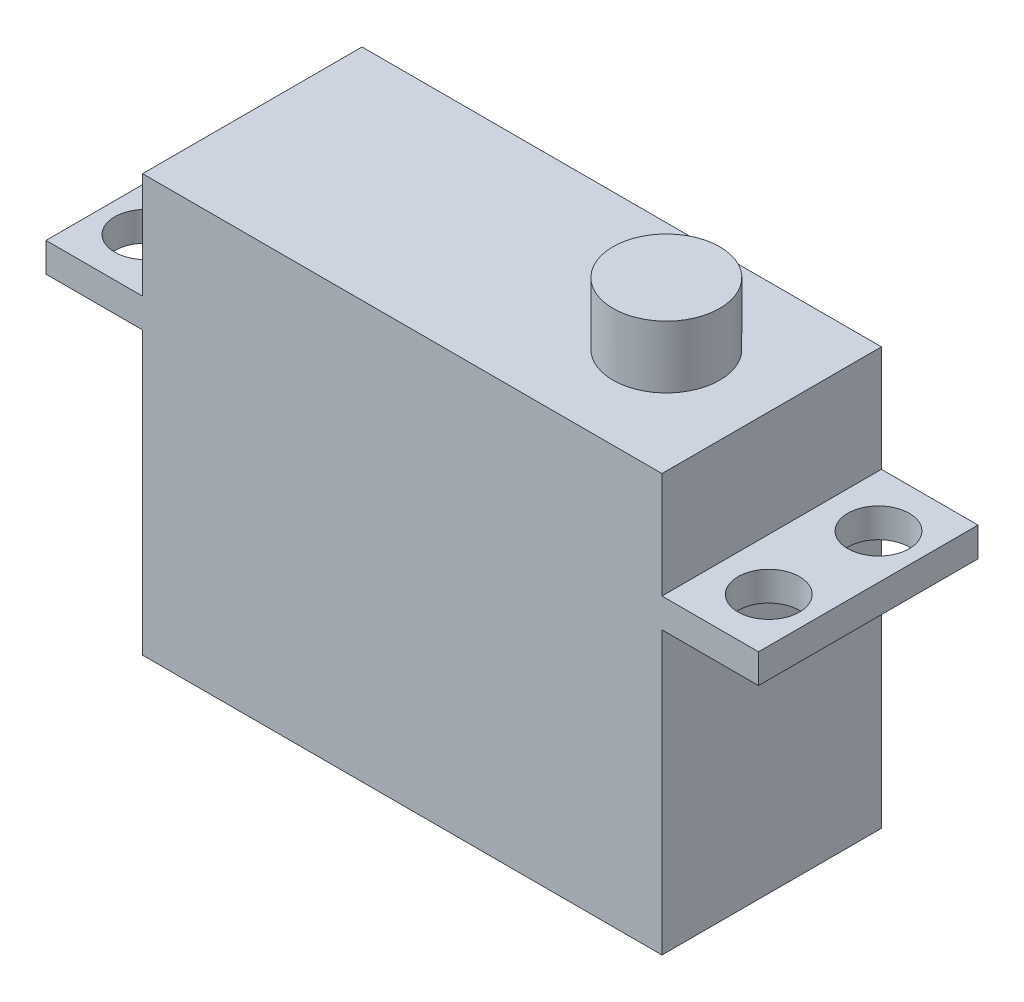
ISO-10303-21;
HEADER;
FILE_DESCRIPTION(('STEP AP214'),'2;1');
FILE_NAME('part.step','',(''),(''),'','','');
FILE_SCHEMA(('AUTOMOTIVE_DESIGN { 1 0 10303 214 1 1 1 1 }'));
ENDSEC;
DATA;
#1=APPLICATION_CONTEXT('core data for automotive mechanical design processes');
#2=APPLICATION_PROTOCOL_DEFINITION('international standard','automotive_design',2000,#1);
#3=PRODUCT_CONTEXT('',#1,'mechanical');
#4=PRODUCT('Part','Part','',(#3));
#5=PRODUCT_RELATED_PRODUCT_CATEGORY('part','',(#4));
#6=PRODUCT_DEFINITION_FORMATION('','',#4);
#7=PRODUCT_DEFINITION_CONTEXT('part definition',#1,'design');
#8=PRODUCT_DEFINITION('design','',#6,#7);
#9=PRODUCT_DEFINITION_SHAPE('','',#8);
#10=(LENGTH_UNIT() NAMED_UNIT(*) SI_UNIT(.MILLI.,.METRE.));
#11=(NAMED_UNIT(*) PLANE_ANGLE_UNIT() SI_UNIT($,.RADIAN.));
#12=(NAMED_UNIT(*) SI_UNIT($,.STERADIAN.) SOLID_ANGLE_UNIT());
#13=UNCERTAINTY_MEASURE_WITH_UNIT(LENGTH_MEASURE(1.E-05),#10,'distance_accuracy_value','');
#14=(GEOMETRIC_REPRESENTATION_CONTEXT(3) GLOBAL_UNCERTAINTY_ASSIGNED_CONTEXT((#13)) GLOBAL_UNIT_ASSIGNED_CONTEXT((#10,
#11,#12)) REPRESENTATION_CONTEXT('',''));
#15=CARTESIAN_POINT('',(0.,0.,0.));
#16=DIRECTION('',(0.,0.,1.));
#17=DIRECTION('',(1.,0.,0.));
#18=AXIS2_PLACEMENT_3D('',#15,#16,#17);
#19=CARTESIAN_POINT('',(0.,21.25,0.));
#20=DIRECTION('',(0.,1.,0.));
#21=DIRECTION('',(0.,0.,1.));
#22=AXIS2_PLACEMENT_3D('',#19,#20,#21);
#23=PLANE('',#22);
#24=DIRECTION('',(0.,0.,1.));
#25=VECTOR('',#24,1.);
#26=CARTESIAN_POINT('',(0.,21.25,-15.));
#27=LINE('',#26,#25);
#28=CARTESIAN_POINT('',(0.,21.25,-15.));
#29=VERTEX_POINT('',#28);
#30=CARTESIAN_POINT('',(0.,21.25,0.));
#31=VERTEX_POINT('',#30);
#32=EDGE_CURVE('E163',#29,#31,#27,.T.);
#33=ORIENTED_EDGE('',*,*,#32,.F.);
#34=DIRECTION('',(-1.,0.,0.));
#35=VECTOR('',#34,1.);
#36=CARTESIAN_POINT('',(0.,21.25,-15.));
#37=LINE('',#36,#35);
#38=CARTESIAN_POINT('',(-6.6,21.25,-15.));
#39=VERTEX_POINT('',#38);
#40=EDGE_CURVE('E183',#29,#39,#37,.T.);
#41=ORIENTED_EDGE('',*,*,#40,.T.);
#42=DIRECTION('',(0.,0.,-1.));
#43=VECTOR('',#42,1.);
#44=CARTESIAN_POINT('',(-6.6,21.25,0.));
#45=LINE('',#44,#43);
#46=CARTESIAN_POINT('',(-6.6,21.25,0.));
#47=VERTEX_POINT('',#46);
#48=EDGE_CURVE('E182',#47,#39,#45,.T.);
#49=ORIENTED_EDGE('',*,*,#48,.F.);
#50=DIRECTION('',(1.,0.,0.));
#51=VECTOR('',#50,1.);
#52=CARTESIAN_POINT('',(0.,21.25,0.));
#53=LINE('',#52,#51);
#54=EDGE_CURVE('E75',#47,#31,#53,.T.);
#55=ORIENTED_EDGE('',*,*,#54,.T.);
#56=EDGE_LOOP('',(#33,#41,#49,#55));
#57=FACE_BOUND('',#56,.T.);
#58=CARTESIAN_POINT('',(-3.54999999999999,21.25,-3.75));
#59=DIRECTION('',(0.,1.,0.));
#60=DIRECTION('',(0.,0.,1.));
#61=AXIS2_PLACEMENT_3D('',#58,#59,#60);
#62=CIRCLE('',#61,2.1);
#63=CARTESIAN_POINT('',(-3.54999999999999,21.25,-1.65));
#64=VERTEX_POINT('',#63);
#65=EDGE_CURVE('E204',#64,#64,#62,.F.);
#66=ORIENTED_EDGE('',*,*,#65,.T.);
#67=EDGE_LOOP('',(#66));
#68=FACE_BOUND('',#67,.T.);
#69=CARTESIAN_POINT('',(-3.54999999999999,21.25,-11.25));
#70=DIRECTION('',(0.,1.,0.));
#71=DIRECTION('',(0.,0.,1.));
#72=AXIS2_PLACEMENT_3D('',#69,#70,#71);
#73=CIRCLE('',#72,2.09999999999998);
#74=CARTESIAN_POINT('',(-3.54999999999999,21.25,-9.15000000000002));
#75=VERTEX_POINT('',#74);
#76=EDGE_CURVE('E200',#75,#75,#73,.T.);
#77=ORIENTED_EDGE('',*,*,#76,.F.);
#78=EDGE_LOOP('',(#77));
#79=FACE_BOUND('',#78,.T.);
#80=ADVANCED_FACE('F51',(#57,#68,#79),#23,.T.);
#81=CARTESIAN_POINT('',(0.,19.25,0.));
#82=DIRECTION('',(1.,0.,0.));
#83=DIRECTION('',(0.,0.,-1.));
#84=AXIS2_PLACEMENT_3D('',#81,#82,#83);
#85=PLANE('',#84);
#86=DIRECTION('',(0.,0.,1.));
#87=VECTOR('',#86,1.);
#88=CARTESIAN_POINT('',(0.,0.,0.));
#89=LINE('',#88,#87);
#90=CARTESIAN_POINT('',(0.,0.,-15.));
#91=VERTEX_POINT('',#90);
#92=CARTESIAN_POINT('',(0.,0.,0.));
#93=VERTEX_POINT('',#92);
#94=EDGE_CURVE('E253',#91,#93,#89,.T.);
#95=ORIENTED_EDGE('',*,*,#94,.T.);
#96=DIRECTION('',(0.,-1.,0.));
#97=VECTOR('',#96,1.);
#98=CARTESIAN_POINT('',(0.,19.25,0.));
#99=LINE('',#98,#97);
#100=CARTESIAN_POINT('',(0.,19.25,0.));
#101=VERTEX_POINT('',#100);
#102=EDGE_CURVE('E12',#101,#93,#99,.T.);
#103=ORIENTED_EDGE('',*,*,#102,.F.);
#104=DIRECTION('',(0.,0.,1.));
#105=VECTOR('',#104,1.);
#106=CARTESIAN_POINT('',(0.,19.25,0.));
#107=LINE('',#106,#105);
#108=CARTESIAN_POINT('',(0.,19.25,-15.));
#109=VERTEX_POINT('',#108);
#110=EDGE_CURVE('E254',#109,#101,#107,.T.);
#111=ORIENTED_EDGE('',*,*,#110,.F.);
#112=DIRECTION('',(0.,-1.,0.));
#113=VECTOR('',#112,1.);
#114=CARTESIAN_POINT('',(0.,19.25,-15.));
#115=LINE('',#114,#113);
#116=EDGE_CURVE('E263',#109,#91,#115,.T.);
#117=ORIENTED_EDGE('',*,*,#116,.T.);
#118=EDGE_LOOP('',(#95,#103,#111,#117));
#119=FACE_BOUND('',#118,.T.);
#120=ADVANCED_FACE('F53',(#119),#85,.F.);
#121=CARTESIAN_POINT('',(0.,19.25,0.));
#122=DIRECTION('',(0.,0.,-1.));
#123=DIRECTION('',(-1.,0.,0.));
#124=AXIS2_PLACEMENT_3D('',#121,#122,#123);
#125=PLANE('',#124);
#126=DIRECTION('',(1.,0.,0.));
#127=VECTOR('',#126,1.);
#128=CARTESIAN_POINT('',(0.,0.,0.));
#129=LINE('',#128,#127);
#130=CARTESIAN_POINT('',(35.5,0.,0.));
#131=VERTEX_POINT('',#130);
#132=EDGE_CURVE('E267',#93,#131,#129,.T.);
#133=ORIENTED_EDGE('',*,*,#132,.T.);
#134=DIRECTION('',(0.,-1.,0.));
#135=VECTOR('',#134,1.);
#136=CARTESIAN_POINT('',(35.5,19.25,0.));
#137=LINE('',#136,#135);
#138=CARTESIAN_POINT('',(35.5,19.25,0.));
#139=VERTEX_POINT('',#138);
#140=EDGE_CURVE('E60',#139,#131,#137,.T.);
#141=ORIENTED_EDGE('',*,*,#140,.F.);
#142=DIRECTION('',(1.,0.,0.));
#143=VECTOR('',#142,1.);
#144=CARTESIAN_POINT('',(0.,19.25,0.));
#145=LINE('',#144,#143);
#146=CARTESIAN_POINT('',(42.1,19.25,0.));
#147=VERTEX_POINT('',#146);
#148=EDGE_CURVE('E215',#139,#147,#145,.T.);
#149=ORIENTED_EDGE('',*,*,#148,.T.);
#150=DIRECTION('',(0.,-1.,0.));
#151=VECTOR('',#150,1.);
#152=CARTESIAN_POINT('',(42.1,21.25,0.));
#153=LINE('',#152,#151);
#154=CARTESIAN_POINT('',(42.1,21.25,0.));
#155=VERTEX_POINT('',#154);
#156=EDGE_CURVE('E242',#155,#147,#153,.T.);
#157=ORIENTED_EDGE('',*,*,#156,.F.);
#158=CARTESIAN_POINT('',(35.5,21.25,0.));
#159=VERTEX_POINT('',#158);
#160=EDGE_CURVE('E167',#159,#155,#53,.T.);
#161=ORIENTED_EDGE('',*,*,#160,.F.);
#162=DIRECTION('',(0.,-1.,0.));
#163=VECTOR('',#162,1.);
#164=CARTESIAN_POINT('',(35.5,28.5,0.));
#165=LINE('',#164,#163);
#166=CARTESIAN_POINT('',(35.5,28.5,0.));
#167=VERTEX_POINT('',#166);
#168=EDGE_CURVE('E146',#167,#159,#165,.T.);
#169=ORIENTED_EDGE('',*,*,#168,.F.);
#170=DIRECTION('',(1.,0.,0.));
#171=VECTOR('',#170,1.);
#172=CARTESIAN_POINT('',(0.,28.5,0.));
#173=LINE('',#172,#171);
#174=CARTESIAN_POINT('',(0.,28.5,0.));
#175=VERTEX_POINT('',#174);
#176=EDGE_CURVE('E153',#175,#167,#173,.T.);
#177=ORIENTED_EDGE('',*,*,#176,.F.);
#178=DIRECTION('',(0.,-1.,0.));
#179=VECTOR('',#178,1.);
#180=CARTESIAN_POINT('',(0.,28.5,0.));
#181=LINE('',#180,#179);
#182=EDGE_CURVE('E333',#175,#31,#181,.T.);
#183=ORIENTED_EDGE('',*,*,#182,.T.);
#184=ORIENTED_EDGE('',*,*,#54,.F.);
#185=DIRECTION('',(0.,-1.,0.));
#186=VECTOR('',#185,1.);
#187=CARTESIAN_POINT('',(-6.6,21.25,0.));
#188=LINE('',#187,#186);
#189=CARTESIAN_POINT('',(-6.6,19.25,0.));
#190=VERTEX_POINT('',#189);
#191=EDGE_CURVE('E246',#47,#190,#188,.T.);
#192=ORIENTED_EDGE('',*,*,#191,.T.);
#193=EDGE_CURVE('E216',#190,#101,#145,.T.);
#194=ORIENTED_EDGE('',*,*,#193,.T.);
#195=ORIENTED_EDGE('',*,*,#102,.T.);
#196=EDGE_LOOP('',(#133,#141,#149,#157,#161,#169,#177,#183,#184,#192,#194,#195));
#197=FACE_BOUND('',#196,.T.);
#198=ADVANCED_FACE('F165',(#197),#125,.F.);
#199=CARTESIAN_POINT('',(35.5,19.25,0.));
#200=DIRECTION('',(-1.,0.,0.));
#201=DIRECTION('',(0.,0.,1.));
#202=AXIS2_PLACEMENT_3D('',#199,#200,#201);
#203=PLANE('',#202);
#204=DIRECTION('',(0.,0.,-1.));
#205=VECTOR('',#204,1.);
#206=CARTESIAN_POINT('',(35.5,0.,0.));
#207=LINE('',#206,#205);
#208=CARTESIAN_POINT('',(35.5,0.,-15.));
#209=VERTEX_POINT('',#208);
#210=EDGE_CURVE('E270',#131,#209,#207,.T.);
#211=ORIENTED_EDGE('',*,*,#210,.T.);
#212=DIRECTION('',(0.,-1.,0.));
#213=VECTOR('',#212,1.);
#214=CARTESIAN_POINT('',(35.5,19.25,-15.));
#215=LINE('',#214,#213);
#216=CARTESIAN_POINT('',(35.5,19.25,-15.));
#217=VERTEX_POINT('',#216);
#218=EDGE_CURVE('E278',#217,#209,#215,.T.);
#219=ORIENTED_EDGE('',*,*,#218,.F.);
#220=DIRECTION('',(0.,0.,-1.));
#221=VECTOR('',#220,1.);
#222=CARTESIAN_POINT('',(35.5,19.25,0.));
#223=LINE('',#222,#221);
#224=EDGE_CURVE('E258',#139,#217,#223,.T.);
#225=ORIENTED_EDGE('',*,*,#224,.F.);
#226=ORIENTED_EDGE('',*,*,#140,.T.);
#227=EDGE_LOOP('',(#211,#219,#225,#226));
#228=FACE_BOUND('',#227,.T.);
#229=ADVANCED_FACE('F286',(#228),#203,.F.);
#230=CARTESIAN_POINT('',(0.,19.25,-15.));
#231=DIRECTION('',(0.,0.,1.));
#232=DIRECTION('',(1.,0.,0.));
#233=AXIS2_PLACEMENT_3D('',#230,#231,#232);
#234=PLANE('',#233);
#235=DIRECTION('',(-1.,0.,0.));
#236=VECTOR('',#235,1.);
#237=CARTESIAN_POINT('',(0.,0.,-15.));
#238=LINE('',#237,#236);
#239=EDGE_CURVE('E259',#209,#91,#238,.T.);
#240=ORIENTED_EDGE('',*,*,#239,.T.);
#241=ORIENTED_EDGE('',*,*,#116,.F.);
#242=DIRECTION('',(-1.,0.,0.));
#243=VECTOR('',#242,1.);
#244=CARTESIAN_POINT('',(0.,19.25,-15.));
#245=LINE('',#244,#243);
#246=CARTESIAN_POINT('',(-6.6,19.25,-15.));
#247=VERTEX_POINT('',#246);
#248=EDGE_CURVE('E169',#109,#247,#245,.T.);
#249=ORIENTED_EDGE('',*,*,#248,.T.);
#250=DIRECTION('',(0.,-1.,0.));
#251=VECTOR('',#250,1.);
#252=CARTESIAN_POINT('',(-6.6,21.25,-15.));
#253=LINE('',#252,#251);
#254=EDGE_CURVE('E249',#39,#247,#253,.T.);
#255=ORIENTED_EDGE('',*,*,#254,.F.);
#256=ORIENTED_EDGE('',*,*,#40,.F.);
#257=DIRECTION('',(0.,-1.,0.));
#258=VECTOR('',#257,1.);
#259=CARTESIAN_POINT('',(0.,28.5,-15.));
#260=LINE('',#259,#258);
#261=CARTESIAN_POINT('',(0.,28.5,-15.));
#262=VERTEX_POINT('',#261);
#263=EDGE_CURVE('E175',#262,#29,#260,.T.);
#264=ORIENTED_EDGE('',*,*,#263,.F.);
#265=DIRECTION('',(-1.,0.,0.));
#266=VECTOR('',#265,1.);
#267=CARTESIAN_POINT('',(35.5,28.5,-15.));
#268=LINE('',#267,#266);
#269=CARTESIAN_POINT('',(35.5,28.5,-15.));
#270=VERTEX_POINT('',#269);
#271=EDGE_CURVE('E152',#270,#262,#268,.T.);
#272=ORIENTED_EDGE('',*,*,#271,.F.);
#273=DIRECTION('',(0.,-1.,0.));
#274=VECTOR('',#273,1.);
#275=CARTESIAN_POINT('',(35.5,28.5,-15.));
#276=LINE('',#275,#274);
#277=CARTESIAN_POINT('',(35.5,21.25,-15.));
#278=VERTEX_POINT('',#277);
#279=EDGE_CURVE('E148',#270,#278,#276,.T.);
#280=ORIENTED_EDGE('',*,*,#279,.T.);
#281=CARTESIAN_POINT('',(42.1,21.25,-15.));
#282=VERTEX_POINT('',#281);
#283=EDGE_CURVE('E179',#282,#278,#37,.T.);
#284=ORIENTED_EDGE('',*,*,#283,.F.);
#285=DIRECTION('',(0.,-1.,0.));
#286=VECTOR('',#285,1.);
#287=CARTESIAN_POINT('',(42.1,21.25,-15.));
#288=LINE('',#287,#286);
#289=CARTESIAN_POINT('',(42.1,19.25,-15.));
#290=VERTEX_POINT('',#289);
#291=EDGE_CURVE('E207',#282,#290,#288,.T.);
#292=ORIENTED_EDGE('',*,*,#291,.T.);
#293=EDGE_CURVE('E173',#290,#217,#245,.T.);
#294=ORIENTED_EDGE('',*,*,#293,.T.);
#295=ORIENTED_EDGE('',*,*,#218,.T.);
#296=EDGE_LOOP('',(#240,#241,#249,#255,#256,#264,#272,#280,#284,#292,#294,#295));
#297=FACE_BOUND('',#296,.T.);
#298=ADVANCED_FACE('F293',(#297),#234,.F.);
#299=CARTESIAN_POINT('',(0.,0.,0.));
#300=DIRECTION('',(0.,-1.,0.));
#301=DIRECTION('',(0.,0.,-1.));
#302=AXIS2_PLACEMENT_3D('',#299,#300,#301);
#303=PLANE('',#302);
#304=ORIENTED_EDGE('',*,*,#94,.F.);
#305=ORIENTED_EDGE('',*,*,#239,.F.);
#306=ORIENTED_EDGE('',*,*,#210,.F.);
#307=ORIENTED_EDGE('',*,*,#132,.F.);
#308=EDGE_LOOP('',(#304,#305,#306,#307));
#309=FACE_BOUND('',#308,.T.);
#310=ADVANCED_FACE('F291',(#309),#303,.T.);
#311=CARTESIAN_POINT('',(0.,19.25,0.));
#312=DIRECTION('',(0.,1.,0.));
#313=DIRECTION('',(0.,0.,1.));
#314=AXIS2_PLACEMENT_3D('',#311,#312,#313);
#315=PLANE('',#314);
#316=CARTESIAN_POINT('',(-3.54999999999999,19.25,-11.25));
#317=DIRECTION('',(0.,1.,0.));
#318=DIRECTION('',(0.,0.,1.));
#319=AXIS2_PLACEMENT_3D('',#316,#317,#318);
#320=CIRCLE('',#319,2.09999999999998);
#321=CARTESIAN_POINT('',(-3.54999999999999,19.25,-9.15000000000002));
#322=VERTEX_POINT('',#321);
#323=EDGE_CURVE('E231',#322,#322,#320,.T.);
#324=ORIENTED_EDGE('',*,*,#323,.T.);
#325=EDGE_LOOP('',(#324));
#326=FACE_BOUND('',#325,.T.);
#327=CARTESIAN_POINT('',(-3.54999999999999,19.25,-3.75));
#328=DIRECTION('',(0.,1.,0.));
#329=DIRECTION('',(0.,0.,1.));
#330=AXIS2_PLACEMENT_3D('',#327,#328,#329);
#331=CIRCLE('',#330,2.1);
#332=CARTESIAN_POINT('',(-3.54999999999999,19.25,-1.65));
#333=VERTEX_POINT('',#332);
#334=EDGE_CURVE('E235',#333,#333,#331,.F.);
#335=ORIENTED_EDGE('',*,*,#334,.F.);
#336=EDGE_LOOP('',(#335));
#337=FACE_BOUND('',#336,.T.);
#338=ORIENTED_EDGE('',*,*,#248,.F.);
#339=ORIENTED_EDGE('',*,*,#110,.T.);
#340=ORIENTED_EDGE('',*,*,#193,.F.);
#341=DIRECTION('',(0.,0.,-1.));
#342=VECTOR('',#341,1.);
#343=CARTESIAN_POINT('',(-6.6,19.25,0.));
#344=LINE('',#343,#342);
#345=EDGE_CURVE('E211',#190,#247,#344,.T.);
#346=ORIENTED_EDGE('',*,*,#345,.T.);
#347=EDGE_LOOP('',(#338,#339,#340,#346));
#348=FACE_BOUND('',#347,.T.);
#349=ADVANCED_FACE('F299',(#326,#337,#348),#315,.F.);
#350=CARTESIAN_POINT('',(39.05,19.25,-11.25));
#351=DIRECTION('',(0.,1.,0.));
#352=DIRECTION('',(0.,0.,1.));
#353=AXIS2_PLACEMENT_3D('',#350,#351,#352);
#354=CIRCLE('',#353,2.09999999999998);
#355=CARTESIAN_POINT('',(39.05,19.25,-9.15000000000002));
#356=VERTEX_POINT('',#355);
#357=EDGE_CURVE('E227',#356,#356,#354,.F.);
#358=ORIENTED_EDGE('',*,*,#357,.F.);
#359=EDGE_LOOP('',(#358));
#360=FACE_BOUND('',#359,.T.);
#361=CARTESIAN_POINT('',(39.05,19.25,-3.75));
#362=DIRECTION('',(0.,1.,0.));
#363=DIRECTION('',(0.,0.,1.));
#364=AXIS2_PLACEMENT_3D('',#361,#362,#363);
#365=CIRCLE('',#364,2.1);
#366=CARTESIAN_POINT('',(39.05,19.25,-1.65));
#367=VERTEX_POINT('',#366);
#368=EDGE_CURVE('E223',#367,#367,#365,.T.);
#369=ORIENTED_EDGE('',*,*,#368,.T.);
#370=EDGE_LOOP('',(#369));
#371=FACE_BOUND('',#370,.T.);
#372=ORIENTED_EDGE('',*,*,#148,.F.);
#373=ORIENTED_EDGE('',*,*,#224,.T.);
#374=ORIENTED_EDGE('',*,*,#293,.F.);
#375=DIRECTION('',(0.,0.,-1.));
#376=VECTOR('',#375,1.);
#377=CARTESIAN_POINT('',(42.1,19.25,0.));
#378=LINE('',#377,#376);
#379=EDGE_CURVE('E220',#147,#290,#378,.T.);
#380=ORIENTED_EDGE('',*,*,#379,.F.);
#381=EDGE_LOOP('',(#372,#373,#374,#380));
#382=FACE_BOUND('',#381,.T.);
#383=ADVANCED_FACE('F317',(#360,#371,#382),#315,.F.);
#384=CARTESIAN_POINT('',(-6.6,21.25,0.));
#385=DIRECTION('',(-1.,0.,0.));
#386=DIRECTION('',(0.,0.,1.));
#387=AXIS2_PLACEMENT_3D('',#384,#385,#386);
#388=PLANE('',#387);
#389=ORIENTED_EDGE('',*,*,#345,.F.);
#390=ORIENTED_EDGE('',*,*,#191,.F.);
#391=ORIENTED_EDGE('',*,*,#48,.T.);
#392=ORIENTED_EDGE('',*,*,#254,.T.);
#393=EDGE_LOOP('',(#389,#390,#391,#392));
#394=FACE_BOUND('',#393,.T.);
#395=ADVANCED_FACE('F304',(#394),#388,.T.);
#396=CARTESIAN_POINT('',(-3.54999999999999,21.25,-11.25));
#397=DIRECTION('',(0.,-1.,0.));
#398=DIRECTION('',(0.,0.,-1.));
#399=AXIS2_PLACEMENT_3D('',#396,#397,#398);
#400=CYLINDRICAL_SURFACE('',#399,2.09999999999998);
#401=ORIENTED_EDGE('',*,*,#76,.T.);
#402=EDGE_LOOP('',(#401));
#403=FACE_BOUND('',#402,.T.);
#404=ORIENTED_EDGE('',*,*,#323,.F.);
#405=EDGE_LOOP('',(#404));
#406=FACE_BOUND('',#405,.T.);
#407=ADVANCED_FACE('F382',(#403,#406),#400,.F.);
#408=CARTESIAN_POINT('',(39.05,21.25,-11.25));
#409=DIRECTION('',(0.,-1.,0.));
#410=DIRECTION('',(0.,0.,-1.));
#411=AXIS2_PLACEMENT_3D('',#408,#409,#410);
#412=CYLINDRICAL_SURFACE('',#411,2.09999999999998);
#413=CARTESIAN_POINT('',(39.05,21.25,-11.25));
#414=DIRECTION('',(0.,1.,0.));
#415=DIRECTION('',(0.,0.,1.));
#416=AXIS2_PLACEMENT_3D('',#413,#414,#415);
#417=CIRCLE('',#416,2.09999999999998);
#418=CARTESIAN_POINT('',(39.05,21.25,-9.15000000000002));
#419=VERTEX_POINT('',#418);
#420=EDGE_CURVE('E196',#419,#419,#417,.F.);
#421=ORIENTED_EDGE('',*,*,#420,.F.);
#422=EDGE_LOOP('',(#421));
#423=FACE_BOUND('',#422,.T.);
#424=ORIENTED_EDGE('',*,*,#357,.T.);
#425=EDGE_LOOP('',(#424));
#426=FACE_BOUND('',#425,.T.);
#427=ADVANCED_FACE('F385',(#423,#426),#412,.F.);
#428=CARTESIAN_POINT('',(39.05,21.25,-3.75));
#429=DIRECTION('',(0.,-1.,0.));
#430=DIRECTION('',(0.,0.,-1.));
#431=AXIS2_PLACEMENT_3D('',#428,#429,#430);
#432=CYLINDRICAL_SURFACE('',#431,2.1);
#433=CARTESIAN_POINT('',(39.05,21.25,-3.75));
#434=DIRECTION('',(0.,1.,0.));
#435=DIRECTION('',(0.,0.,1.));
#436=AXIS2_PLACEMENT_3D('',#433,#434,#435);
#437=CIRCLE('',#436,2.1);
#438=CARTESIAN_POINT('',(39.05,21.25,-1.65));
#439=VERTEX_POINT('',#438);
#440=EDGE_CURVE('E192',#439,#439,#437,.T.);
#441=ORIENTED_EDGE('',*,*,#440,.T.);
#442=EDGE_LOOP('',(#441));
#443=FACE_BOUND('',#442,.T.);
#444=ORIENTED_EDGE('',*,*,#368,.F.);
#445=EDGE_LOOP('',(#444));
#446=FACE_BOUND('',#445,.T.);
#447=ADVANCED_FACE('F377',(#443,#446),#432,.F.);
#448=CARTESIAN_POINT('',(42.1,21.25,0.));
#449=DIRECTION('',(-1.,0.,0.));
#450=DIRECTION('',(0.,0.,1.));
#451=AXIS2_PLACEMENT_3D('',#448,#449,#450);
#452=PLANE('',#451);
#453=ORIENTED_EDGE('',*,*,#379,.T.);
#454=ORIENTED_EDGE('',*,*,#291,.F.);
#455=DIRECTION('',(0.,0.,-1.));
#456=VECTOR('',#455,1.);
#457=CARTESIAN_POINT('',(42.1,21.25,0.));
#458=LINE('',#457,#456);
#459=EDGE_CURVE('E189',#155,#282,#458,.T.);
#460=ORIENTED_EDGE('',*,*,#459,.F.);
#461=ORIENTED_EDGE('',*,*,#156,.T.);
#462=EDGE_LOOP('',(#453,#454,#460,#461));
#463=FACE_BOUND('',#462,.T.);
#464=ADVANCED_FACE('F314',(#463),#452,.F.);
#465=CARTESIAN_POINT('',(-3.54999999999999,21.25,-3.75));
#466=DIRECTION('',(0.,-1.,0.));
#467=DIRECTION('',(0.,0.,-1.));
#468=AXIS2_PLACEMENT_3D('',#465,#466,#467);
#469=CYLINDRICAL_SURFACE('',#468,2.1);
#470=ORIENTED_EDGE('',*,*,#65,.F.);
#471=EDGE_LOOP('',(#470));
#472=FACE_BOUND('',#471,.T.);
#473=ORIENTED_EDGE('',*,*,#334,.T.);
#474=EDGE_LOOP('',(#473));
#475=FACE_BOUND('',#474,.T.);
#476=ADVANCED_FACE('F367',(#472,#475),#469,.F.);
#477=DIRECTION('',(0.,0.,-1.));
#478=VECTOR('',#477,1.);
#479=CARTESIAN_POINT('',(35.5,21.25,0.));
#480=LINE('',#479,#478);
#481=EDGE_CURVE('E67',#159,#278,#480,.T.);
#482=ORIENTED_EDGE('',*,*,#481,.F.);
#483=ORIENTED_EDGE('',*,*,#160,.T.);
#484=ORIENTED_EDGE('',*,*,#459,.T.);
#485=ORIENTED_EDGE('',*,*,#283,.T.);
#486=EDGE_LOOP('',(#482,#483,#484,#485));
#487=FACE_BOUND('',#486,.T.);
#488=ORIENTED_EDGE('',*,*,#440,.F.);
#489=EDGE_LOOP('',(#488));
#490=FACE_BOUND('',#489,.T.);
#491=ORIENTED_EDGE('',*,*,#420,.T.);
#492=EDGE_LOOP('',(#491));
#493=FACE_BOUND('',#492,.T.);
#494=ADVANCED_FACE('F319',(#487,#490,#493),#23,.T.);
#495=CARTESIAN_POINT('',(35.5,28.5,0.));
#496=DIRECTION('',(-1.,0.,0.));
#497=DIRECTION('',(0.,0.,1.));
#498=AXIS2_PLACEMENT_3D('',#495,#496,#497);
#499=PLANE('',#498);
#500=ORIENTED_EDGE('',*,*,#481,.T.);
#501=ORIENTED_EDGE('',*,*,#279,.F.);
#502=DIRECTION('',(0.,0.,-1.));
#503=VECTOR('',#502,1.);
#504=CARTESIAN_POINT('',(35.5,28.5,0.));
#505=LINE('',#504,#503);
#506=EDGE_CURVE('E142',#167,#270,#505,.T.);
#507=ORIENTED_EDGE('',*,*,#506,.F.);
#508=ORIENTED_EDGE('',*,*,#168,.T.);
#509=EDGE_LOOP('',(#500,#501,#507,#508));
#510=FACE_BOUND('',#509,.T.);
#511=ADVANCED_FACE('F144',(#510),#499,.F.);
#512=CARTESIAN_POINT('',(0.,28.5,-15.));
#513=DIRECTION('',(1.,0.,0.));
#514=DIRECTION('',(0.,0.,-1.));
#515=AXIS2_PLACEMENT_3D('',#512,#513,#514);
#516=PLANE('',#515);
#517=ORIENTED_EDGE('',*,*,#32,.T.);
#518=ORIENTED_EDGE('',*,*,#182,.F.);
#519=DIRECTION('',(0.,0.,1.));
#520=VECTOR('',#519,1.);
#521=CARTESIAN_POINT('',(0.,28.5,-15.));
#522=LINE('',#521,#520);
#523=EDGE_CURVE('E158',#262,#175,#522,.T.);
#524=ORIENTED_EDGE('',*,*,#523,.F.);
#525=ORIENTED_EDGE('',*,*,#263,.T.);
#526=EDGE_LOOP('',(#517,#518,#524,#525));
#527=FACE_BOUND('',#526,.T.);
#528=ADVANCED_FACE('F337',(#527),#516,.F.);
#529=CARTESIAN_POINT('',(0.,28.5,0.));
#530=DIRECTION('',(0.,1.,0.));
#531=DIRECTION('',(0.,0.,1.));
#532=AXIS2_PLACEMENT_3D('',#529,#530,#531);
#533=PLANE('',#532);
#534=CARTESIAN_POINT('',(28.3,28.5,-7.5));
#535=DIRECTION('',(0.,1.,0.));
#536=DIRECTION('',(0.,0.,1.));
#537=AXIS2_PLACEMENT_3D('',#534,#535,#536);
#538=CIRCLE('',#537,3.649626987733);
#539=CARTESIAN_POINT('',(28.3,28.5,-3.850373012267));
#540=VERTEX_POINT('',#539);
#541=EDGE_CURVE('E328',#540,#540,#538,.T.);
#542=ORIENTED_EDGE('',*,*,#541,.F.);
#543=EDGE_LOOP('',(#542));
#544=FACE_BOUND('',#543,.T.);
#545=ORIENTED_EDGE('',*,*,#176,.T.);
#546=ORIENTED_EDGE('',*,*,#506,.T.);
#547=ORIENTED_EDGE('',*,*,#271,.T.);
#548=ORIENTED_EDGE('',*,*,#523,.T.);
#549=EDGE_LOOP('',(#545,#546,#547,#548));
#550=FACE_BOUND('',#549,.T.);
#551=ADVANCED_FACE('F156',(#544,#550),#533,.T.);
#552=CARTESIAN_POINT('',(28.3,75.8227039673097,-7.5));
#553=DIRECTION('',(0.,-1.,0.));
#554=DIRECTION('',(0.,0.,-1.));
#555=AXIS2_PLACEMENT_3D('',#552,#553,#554);
#556=CYLINDRICAL_SURFACE('',#555,3.649626987733);
#557=CARTESIAN_POINT('',(28.3,32.75,-7.5));
#558=DIRECTION('',(0.,-1.,0.));
#559=DIRECTION('',(0.,0.,-1.));
#560=AXIS2_PLACEMENT_3D('',#557,#558,#559);
#561=CIRCLE('',#560,3.649626987733);
#562=CARTESIAN_POINT('',(28.3,32.75,-11.149626987733));
#563=VERTEX_POINT('',#562);
#564=EDGE_CURVE('E322',#563,#563,#561,.T.);
#565=ORIENTED_EDGE('',*,*,#564,.T.);
#566=EDGE_LOOP('',(#565));
#567=FACE_BOUND('',#566,.T.);
#568=ORIENTED_EDGE('',*,*,#541,.T.);
#569=EDGE_LOOP('',(#568));
#570=FACE_BOUND('',#569,.T.);
#571=ADVANCED_FACE('F345',(#567,#570),#556,.T.);
#572=CARTESIAN_POINT('',(0.,32.75,0.));
#573=DIRECTION('',(0.,-1.,0.));
#574=DIRECTION('',(0.,0.,-1.));
#575=AXIS2_PLACEMENT_3D('',#572,#573,#574);
#576=PLANE('',#575);
#577=ORIENTED_EDGE('',*,*,#564,.F.);
#578=EDGE_LOOP('',(#577));
#579=FACE_BOUND('',#578,.T.);
#580=ADVANCED_FACE('F353',(#579),#576,.F.);
#581=CLOSED_SHELL('',(#80,#120,#198,#229,#298,#310,#349,#383,#395,#407,#427,#447,#464,#476,#494,
#511,#528,#551,#571,#580));
#582=MANIFOLD_SOLID_BREP('B2',#581);
#583=ADVANCED_BREP_SHAPE_REPRESENTATION('',(#18,#582),#14);
#584=SHAPE_DEFINITION_REPRESENTATION(#9,#583);
ENDSEC;
END-ISO-10303-21;
